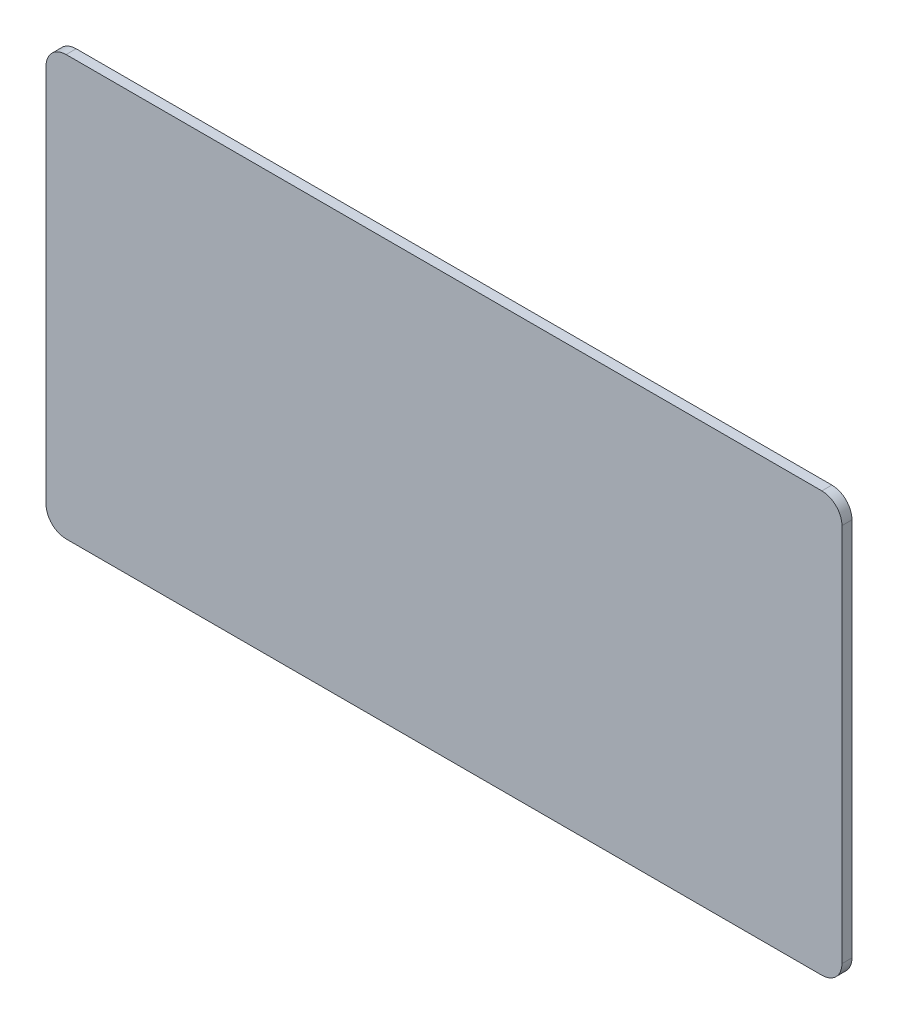
ISO-10303-21;
HEADER;
FILE_DESCRIPTION(('STEP AP214'),'2;1');
FILE_NAME('part.step','',(''),(''),'','','');
FILE_SCHEMA(('AUTOMOTIVE_DESIGN { 1 0 10303 214 1 1 1 1 }'));
ENDSEC;
DATA;
#1=APPLICATION_CONTEXT('core data for automotive mechanical design processes');
#2=APPLICATION_PROTOCOL_DEFINITION('international standard','automotive_design',2000,#1);
#3=PRODUCT_CONTEXT('',#1,'mechanical');
#4=PRODUCT('Part','Part','',(#3));
#5=PRODUCT_RELATED_PRODUCT_CATEGORY('part','',(#4));
#6=PRODUCT_DEFINITION_FORMATION('','',#4);
#7=PRODUCT_DEFINITION_CONTEXT('part definition',#1,'design');
#8=PRODUCT_DEFINITION('design','',#6,#7);
#9=PRODUCT_DEFINITION_SHAPE('','',#8);
#10=(LENGTH_UNIT() NAMED_UNIT(*) SI_UNIT(.MILLI.,.METRE.));
#11=(NAMED_UNIT(*) PLANE_ANGLE_UNIT() SI_UNIT($,.RADIAN.));
#12=(NAMED_UNIT(*) SI_UNIT($,.STERADIAN.) SOLID_ANGLE_UNIT());
#13=UNCERTAINTY_MEASURE_WITH_UNIT(LENGTH_MEASURE(1.E-05),#10,'distance_accuracy_value','');
#14=(GEOMETRIC_REPRESENTATION_CONTEXT(3) GLOBAL_UNCERTAINTY_ASSIGNED_CONTEXT((#13)) GLOBAL_UNIT_ASSIGNED_CONTEXT((#10,
#11,#12)) REPRESENTATION_CONTEXT('',''));
#15=CARTESIAN_POINT('',(0.,0.,0.));
#16=DIRECTION('',(0.,0.,1.));
#17=DIRECTION('',(1.,0.,0.));
#18=AXIS2_PLACEMENT_3D('',#15,#16,#17);
#19=CARTESIAN_POINT('',(0.,0.,3.81));
#20=DIRECTION('',(0.,0.,-1.));
#21=DIRECTION('',(-1.,0.,0.));
#22=AXIS2_PLACEMENT_3D('',#19,#20,#21);
#23=PLANE('',#22);
#24=CARTESIAN_POINT('',(-47.8155,30.353,3.81));
#25=DIRECTION('',(0.,0.,-1.));
#26=DIRECTION('',(-1.,0.,0.));
#27=AXIS2_PLACEMENT_3D('',#24,#25,#26);
#28=CIRCLE('',#27,2.54);
#29=CARTESIAN_POINT('',(-47.8155,32.893,3.81));
#30=VERTEX_POINT('',#29);
#31=CARTESIAN_POINT('',(-50.3555,30.353,3.81));
#32=VERTEX_POINT('',#31);
#33=EDGE_CURVE('E100',#30,#32,#28,.F.);
#34=ORIENTED_EDGE('',*,*,#33,.F.);
#35=DIRECTION('',(1.,0.,0.));
#36=VECTOR('',#35,1.);
#37=CARTESIAN_POINT('',(50.3555,32.893,3.81));
#38=LINE('',#37,#36);
#39=CARTESIAN_POINT('',(47.8155,32.893,3.81));
#40=VERTEX_POINT('',#39);
#41=EDGE_CURVE('E135',#30,#40,#38,.T.);
#42=ORIENTED_EDGE('',*,*,#41,.T.);
#43=CARTESIAN_POINT('',(47.8155,30.353,3.81));
#44=DIRECTION('',(0.,0.,-1.));
#45=DIRECTION('',(-1.,0.,0.));
#46=AXIS2_PLACEMENT_3D('',#43,#44,#45);
#47=CIRCLE('',#46,2.54);
#48=CARTESIAN_POINT('',(50.3555,30.353,3.81));
#49=VERTEX_POINT('',#48);
#50=EDGE_CURVE('E108',#49,#40,#47,.F.);
#51=ORIENTED_EDGE('',*,*,#50,.F.);
#52=DIRECTION('',(0.,-1.,0.));
#53=VECTOR('',#52,1.);
#54=CARTESIAN_POINT('',(50.3555,20.193,3.81));
#55=LINE('',#54,#53);
#56=CARTESIAN_POINT('',(50.3555,-17.653,3.81));
#57=VERTEX_POINT('',#56);
#58=EDGE_CURVE('E137',#49,#57,#55,.T.);
#59=ORIENTED_EDGE('',*,*,#58,.T.);
#60=CARTESIAN_POINT('',(47.8155,-17.653,3.81));
#61=DIRECTION('',(0.,0.,-1.));
#62=DIRECTION('',(-1.,0.,0.));
#63=AXIS2_PLACEMENT_3D('',#60,#61,#62);
#64=CIRCLE('',#63,2.54);
#65=CARTESIAN_POINT('',(47.8155,-20.193,3.81));
#66=VERTEX_POINT('',#65);
#67=EDGE_CURVE('E36',#66,#57,#64,.F.);
#68=ORIENTED_EDGE('',*,*,#67,.F.);
#69=DIRECTION('',(-1.,0.,0.));
#70=VECTOR('',#69,1.);
#71=CARTESIAN_POINT('',(-50.3555,-20.193,3.81));
#72=LINE('',#71,#70);
#73=CARTESIAN_POINT('',(-47.8155,-20.193,3.81));
#74=VERTEX_POINT('',#73);
#75=EDGE_CURVE('E113',#66,#74,#72,.T.);
#76=ORIENTED_EDGE('',*,*,#75,.T.);
#77=CARTESIAN_POINT('',(-47.8155,-17.653,3.81));
#78=DIRECTION('',(0.,0.,-1.));
#79=DIRECTION('',(-1.,0.,0.));
#80=AXIS2_PLACEMENT_3D('',#77,#78,#79);
#81=CIRCLE('',#80,2.54);
#82=CARTESIAN_POINT('',(-50.3555,-17.653,3.81));
#83=VERTEX_POINT('',#82);
#84=EDGE_CURVE('E112',#83,#74,#81,.F.);
#85=ORIENTED_EDGE('',*,*,#84,.F.);
#86=DIRECTION('',(0.,1.,0.));
#87=VECTOR('',#86,1.);
#88=CARTESIAN_POINT('',(-50.3555,20.193,3.81));
#89=LINE('',#88,#87);
#90=EDGE_CURVE('E109',#83,#32,#89,.T.);
#91=ORIENTED_EDGE('',*,*,#90,.T.);
#92=EDGE_LOOP('',(#34,#42,#51,#59,#68,#76,#85,#91));
#93=FACE_BOUND('',#92,.T.);
#94=ADVANCED_FACE('F32',(#93),#23,.T.);
#95=CARTESIAN_POINT('',(-50.3555,20.193,5.08));
#96=DIRECTION('',(1.,0.,0.));
#97=DIRECTION('',(0.,0.,-1.));
#98=AXIS2_PLACEMENT_3D('',#95,#96,#97);
#99=PLANE('',#98);
#100=ORIENTED_EDGE('',*,*,#90,.F.);
#101=DIRECTION('',(0.,0.,-1.));
#102=VECTOR('',#101,1.);
#103=CARTESIAN_POINT('',(-50.3555,-17.653,5.08));
#104=LINE('',#103,#102);
#105=CARTESIAN_POINT('',(-50.3555,-17.653,5.08));
#106=VERTEX_POINT('',#105);
#107=EDGE_CURVE('E55',#83,#106,#104,.F.);
#108=ORIENTED_EDGE('',*,*,#107,.T.);
#109=DIRECTION('',(0.,-1.,0.));
#110=VECTOR('',#109,1.);
#111=CARTESIAN_POINT('',(-50.3555,20.193,5.08));
#112=LINE('',#111,#110);
#113=CARTESIAN_POINT('',(-50.3555,30.353,5.08));
#114=VERTEX_POINT('',#113);
#115=EDGE_CURVE('E11',#114,#106,#112,.T.);
#116=ORIENTED_EDGE('',*,*,#115,.F.);
#117=DIRECTION('',(0.,0.,-1.));
#118=VECTOR('',#117,1.);
#119=CARTESIAN_POINT('',(-50.3555,30.353,5.08));
#120=LINE('',#119,#118);
#121=EDGE_CURVE('E103',#114,#32,#120,.T.);
#122=ORIENTED_EDGE('',*,*,#121,.T.);
#123=EDGE_LOOP('',(#100,#108,#116,#122));
#124=FACE_BOUND('',#123,.T.);
#125=ADVANCED_FACE('F115',(#124),#99,.F.);
#126=CARTESIAN_POINT('',(-50.3555,-20.193,5.08));
#127=DIRECTION('',(0.,1.,0.));
#128=DIRECTION('',(0.,0.,1.));
#129=AXIS2_PLACEMENT_3D('',#126,#127,#128);
#130=PLANE('',#129);
#131=ORIENTED_EDGE('',*,*,#75,.F.);
#132=DIRECTION('',(0.,0.,-1.));
#133=VECTOR('',#132,1.);
#134=CARTESIAN_POINT('',(47.8155,-20.193,5.08));
#135=LINE('',#134,#133);
#136=CARTESIAN_POINT('',(47.8155,-20.193,5.08));
#137=VERTEX_POINT('',#136);
#138=EDGE_CURVE('E130',#66,#137,#135,.F.);
#139=ORIENTED_EDGE('',*,*,#138,.T.);
#140=DIRECTION('',(1.,0.,0.));
#141=VECTOR('',#140,1.);
#142=CARTESIAN_POINT('',(-50.3555,-20.193,5.08));
#143=LINE('',#142,#141);
#144=CARTESIAN_POINT('',(-47.8155,-20.193,5.08));
#145=VERTEX_POINT('',#144);
#146=EDGE_CURVE('E41',#145,#137,#143,.T.);
#147=ORIENTED_EDGE('',*,*,#146,.F.);
#148=DIRECTION('',(0.,0.,-1.));
#149=VECTOR('',#148,1.);
#150=CARTESIAN_POINT('',(-47.8155,-20.193,5.08));
#151=LINE('',#150,#149);
#152=EDGE_CURVE('E132',#145,#74,#151,.T.);
#153=ORIENTED_EDGE('',*,*,#152,.T.);
#154=EDGE_LOOP('',(#131,#139,#147,#153));
#155=FACE_BOUND('',#154,.T.);
#156=ADVANCED_FACE('F182',(#155),#130,.F.);
#157=CARTESIAN_POINT('',(50.3555,20.193,5.08));
#158=DIRECTION('',(-1.,0.,0.));
#159=DIRECTION('',(0.,0.,1.));
#160=AXIS2_PLACEMENT_3D('',#157,#158,#159);
#161=PLANE('',#160);
#162=ORIENTED_EDGE('',*,*,#58,.F.);
#163=DIRECTION('',(0.,0.,-1.));
#164=VECTOR('',#163,1.);
#165=CARTESIAN_POINT('',(50.3555,30.353,5.08));
#166=LINE('',#165,#164);
#167=CARTESIAN_POINT('',(50.3555,30.353,5.08));
#168=VERTEX_POINT('',#167);
#169=EDGE_CURVE('E128',#49,#168,#166,.F.);
#170=ORIENTED_EDGE('',*,*,#169,.T.);
#171=DIRECTION('',(0.,1.,0.));
#172=VECTOR('',#171,1.);
#173=CARTESIAN_POINT('',(50.3555,-20.193,5.08));
#174=LINE('',#173,#172);
#175=CARTESIAN_POINT('',(50.3555,-17.653,5.08));
#176=VERTEX_POINT('',#175);
#177=EDGE_CURVE('E155',#176,#168,#174,.T.);
#178=ORIENTED_EDGE('',*,*,#177,.F.);
#179=DIRECTION('',(0.,0.,-1.));
#180=VECTOR('',#179,1.);
#181=CARTESIAN_POINT('',(50.3555,-17.653,5.08));
#182=LINE('',#181,#180);
#183=EDGE_CURVE('E125',#176,#57,#182,.T.);
#184=ORIENTED_EDGE('',*,*,#183,.T.);
#185=EDGE_LOOP('',(#162,#170,#178,#184));
#186=FACE_BOUND('',#185,.T.);
#187=ADVANCED_FACE('F153',(#186),#161,.F.);
#188=CARTESIAN_POINT('',(50.3555,32.893,5.08));
#189=DIRECTION('',(0.,-1.,0.));
#190=DIRECTION('',(1.,0.,0.));
#191=AXIS2_PLACEMENT_3D('',#188,#189,#190);
#192=PLANE('',#191);
#193=ORIENTED_EDGE('',*,*,#41,.F.);
#194=DIRECTION('',(0.,0.,-1.));
#195=VECTOR('',#194,1.);
#196=CARTESIAN_POINT('',(-47.8155,32.893,5.08));
#197=LINE('',#196,#195);
#198=CARTESIAN_POINT('',(-47.8155,32.893,5.08));
#199=VERTEX_POINT('',#198);
#200=EDGE_CURVE('E104',#30,#199,#197,.F.);
#201=ORIENTED_EDGE('',*,*,#200,.T.);
#202=DIRECTION('',(-1.,0.,0.));
#203=VECTOR('',#202,1.);
#204=CARTESIAN_POINT('',(50.3555,32.893,5.08));
#205=LINE('',#204,#203);
#206=CARTESIAN_POINT('',(47.8155,32.893,5.08));
#207=VERTEX_POINT('',#206);
#208=EDGE_CURVE('E118',#207,#199,#205,.T.);
#209=ORIENTED_EDGE('',*,*,#208,.F.);
#210=DIRECTION('',(0.,0.,-1.));
#211=VECTOR('',#210,1.);
#212=CARTESIAN_POINT('',(47.8155,32.893,5.08));
#213=LINE('',#212,#211);
#214=EDGE_CURVE('E116',#207,#40,#213,.T.);
#215=ORIENTED_EDGE('',*,*,#214,.T.);
#216=EDGE_LOOP('',(#193,#201,#209,#215));
#217=FACE_BOUND('',#216,.T.);
#218=ADVANCED_FACE('F172',(#217),#192,.F.);
#219=CARTESIAN_POINT('',(-47.8155,30.353,5.08));
#220=DIRECTION('',(0.,0.,-1.));
#221=DIRECTION('',(-1.,0.,0.));
#222=AXIS2_PLACEMENT_3D('',#219,#220,#221);
#223=CYLINDRICAL_SURFACE('',#222,2.54);
#224=ORIENTED_EDGE('',*,*,#200,.F.);
#225=ORIENTED_EDGE('',*,*,#33,.T.);
#226=ORIENTED_EDGE('',*,*,#121,.F.);
#227=CARTESIAN_POINT('',(-47.8155,30.353,5.08));
#228=DIRECTION('',(0.,0.,1.));
#229=DIRECTION('',(1.,0.,0.));
#230=AXIS2_PLACEMENT_3D('',#227,#228,#229);
#231=CIRCLE('',#230,2.54);
#232=EDGE_CURVE('E48',#199,#114,#231,.T.);
#233=ORIENTED_EDGE('',*,*,#232,.F.);
#234=EDGE_LOOP('',(#224,#225,#226,#233));
#235=FACE_BOUND('',#234,.T.);
#236=ADVANCED_FACE('F34',(#235),#223,.T.);
#237=CARTESIAN_POINT('',(47.8155,30.353,5.08));
#238=DIRECTION('',(0.,0.,-1.));
#239=DIRECTION('',(-1.,0.,0.));
#240=AXIS2_PLACEMENT_3D('',#237,#238,#239);
#241=CYLINDRICAL_SURFACE('',#240,2.54);
#242=ORIENTED_EDGE('',*,*,#169,.F.);
#243=ORIENTED_EDGE('',*,*,#50,.T.);
#244=ORIENTED_EDGE('',*,*,#214,.F.);
#245=CARTESIAN_POINT('',(47.8155,30.353,5.08));
#246=DIRECTION('',(0.,0.,1.));
#247=DIRECTION('',(1.,0.,0.));
#248=AXIS2_PLACEMENT_3D('',#245,#246,#247);
#249=CIRCLE('',#248,2.54);
#250=EDGE_CURVE('E165',#168,#207,#249,.T.);
#251=ORIENTED_EDGE('',*,*,#250,.F.);
#252=EDGE_LOOP('',(#242,#243,#244,#251));
#253=FACE_BOUND('',#252,.T.);
#254=ADVANCED_FACE('F173',(#253),#241,.T.);
#255=CARTESIAN_POINT('',(-47.8155,-17.653,5.08));
#256=DIRECTION('',(0.,0.,-1.));
#257=DIRECTION('',(-1.,0.,0.));
#258=AXIS2_PLACEMENT_3D('',#255,#256,#257);
#259=CYLINDRICAL_SURFACE('',#258,2.54);
#260=ORIENTED_EDGE('',*,*,#107,.F.);
#261=ORIENTED_EDGE('',*,*,#84,.T.);
#262=ORIENTED_EDGE('',*,*,#152,.F.);
#263=CARTESIAN_POINT('',(-47.8155,-17.653,5.08));
#264=DIRECTION('',(0.,0.,1.));
#265=DIRECTION('',(1.,0.,0.));
#266=AXIS2_PLACEMENT_3D('',#263,#264,#265);
#267=CIRCLE('',#266,2.54);
#268=EDGE_CURVE('E163',#106,#145,#267,.T.);
#269=ORIENTED_EDGE('',*,*,#268,.F.);
#270=EDGE_LOOP('',(#260,#261,#262,#269));
#271=FACE_BOUND('',#270,.T.);
#272=ADVANCED_FACE('F175',(#271),#259,.T.);
#273=CARTESIAN_POINT('',(47.8155,-17.653,5.08));
#274=DIRECTION('',(0.,0.,-1.));
#275=DIRECTION('',(-1.,0.,0.));
#276=AXIS2_PLACEMENT_3D('',#273,#274,#275);
#277=CYLINDRICAL_SURFACE('',#276,2.54);
#278=ORIENTED_EDGE('',*,*,#138,.F.);
#279=ORIENTED_EDGE('',*,*,#67,.T.);
#280=ORIENTED_EDGE('',*,*,#183,.F.);
#281=CARTESIAN_POINT('',(47.8155,-17.653,5.08));
#282=DIRECTION('',(0.,0.,1.));
#283=DIRECTION('',(1.,0.,0.));
#284=AXIS2_PLACEMENT_3D('',#281,#282,#283);
#285=CIRCLE('',#284,2.54);
#286=EDGE_CURVE('E124',#137,#176,#285,.T.);
#287=ORIENTED_EDGE('',*,*,#286,.F.);
#288=EDGE_LOOP('',(#278,#279,#280,#287));
#289=FACE_BOUND('',#288,.T.);
#290=ADVANCED_FACE('F146',(#289),#277,.T.);
#291=CARTESIAN_POINT('',(0.,0.,5.08));
#292=DIRECTION('',(0.,0.,1.));
#293=DIRECTION('',(1.,0.,0.));
#294=AXIS2_PLACEMENT_3D('',#291,#292,#293);
#295=PLANE('',#294);
#296=ORIENTED_EDGE('',*,*,#208,.T.);
#297=ORIENTED_EDGE('',*,*,#232,.T.);
#298=ORIENTED_EDGE('',*,*,#115,.T.);
#299=ORIENTED_EDGE('',*,*,#268,.T.);
#300=ORIENTED_EDGE('',*,*,#146,.T.);
#301=ORIENTED_EDGE('',*,*,#286,.T.);
#302=ORIENTED_EDGE('',*,*,#177,.T.);
#303=ORIENTED_EDGE('',*,*,#250,.T.);
#304=EDGE_LOOP('',(#296,#297,#298,#299,#300,#301,#302,#303));
#305=FACE_BOUND('',#304,.T.);
#306=ADVANCED_FACE('F168',(#305),#295,.T.);
#307=CLOSED_SHELL('',(#94,#125,#156,#187,#218,#236,#254,#272,#290,#306));
#308=MANIFOLD_SOLID_BREP('B2',#307);
#309=ADVANCED_BREP_SHAPE_REPRESENTATION('',(#18,#308),#14);
#310=SHAPE_DEFINITION_REPRESENTATION(#9,#309);
ENDSEC;
END-ISO-10303-21;
